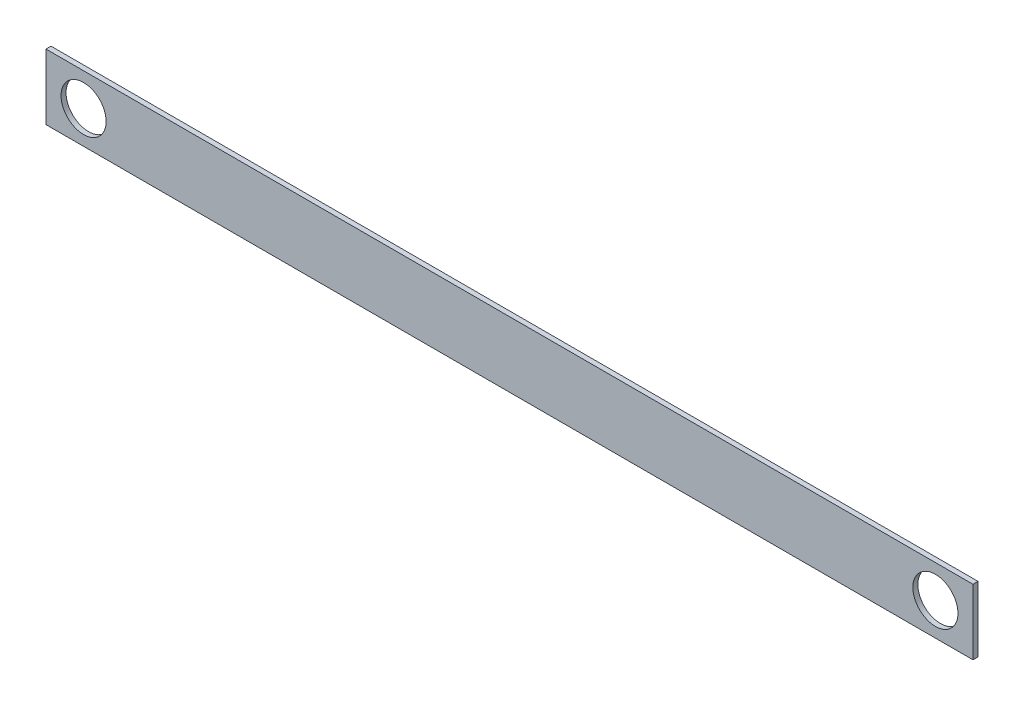
ISO-10303-21;
HEADER;
FILE_DESCRIPTION(('STEP AP214'),'2;1');
FILE_NAME('part.step','',(''),(''),'','','');
FILE_SCHEMA(('AUTOMOTIVE_DESIGN { 1 0 10303 214 1 1 1 1 }'));
ENDSEC;
DATA;
#1=APPLICATION_CONTEXT('core data for automotive mechanical design processes');
#2=APPLICATION_PROTOCOL_DEFINITION('international standard','automotive_design',2000,#1);
#3=PRODUCT_CONTEXT('',#1,'mechanical');
#4=PRODUCT('Part','Part','',(#3));
#5=PRODUCT_RELATED_PRODUCT_CATEGORY('part','',(#4));
#6=PRODUCT_DEFINITION_FORMATION('','',#4);
#7=PRODUCT_DEFINITION_CONTEXT('part definition',#1,'design');
#8=PRODUCT_DEFINITION('design','',#6,#7);
#9=PRODUCT_DEFINITION_SHAPE('','',#8);
#10=(LENGTH_UNIT() NAMED_UNIT(*) SI_UNIT(.MILLI.,.METRE.));
#11=(NAMED_UNIT(*) PLANE_ANGLE_UNIT() SI_UNIT($,.RADIAN.));
#12=(NAMED_UNIT(*) SI_UNIT($,.STERADIAN.) SOLID_ANGLE_UNIT());
#13=UNCERTAINTY_MEASURE_WITH_UNIT(LENGTH_MEASURE(1.E-05),#10,'distance_accuracy_value','');
#14=(GEOMETRIC_REPRESENTATION_CONTEXT(3) GLOBAL_UNCERTAINTY_ASSIGNED_CONTEXT((#13)) GLOBAL_UNIT_ASSIGNED_CONTEXT((#10,
#11,#12)) REPRESENTATION_CONTEXT('',''));
#15=CARTESIAN_POINT('',(0.,0.,0.));
#16=DIRECTION('',(0.,0.,1.));
#17=DIRECTION('',(1.,0.,0.));
#18=AXIS2_PLACEMENT_3D('',#15,#16,#17);
#19=CARTESIAN_POINT('',(-124.719101123596,20.1926163723917,2.));
#20=DIRECTION('',(1.,0.,0.));
#21=DIRECTION('',(0.,0.,-1.));
#22=AXIS2_PLACEMENT_3D('',#19,#20,#21);
#23=PLANE('',#22);
#24=DIRECTION('',(0.,-1.,0.));
#25=VECTOR('',#24,1.);
#26=CARTESIAN_POINT('',(-124.719101123596,20.1926163723917,0.));
#27=LINE('',#26,#25);
#28=CARTESIAN_POINT('',(-124.719101123596,20.1926163723917,0.));
#29=VERTEX_POINT('',#28);
#30=CARTESIAN_POINT('',(-124.719101123596,-5.9390048154093,0.));
#31=VERTEX_POINT('',#30);
#32=EDGE_CURVE('E96',#29,#31,#27,.T.);
#33=ORIENTED_EDGE('',*,*,#32,.T.);
#34=DIRECTION('',(0.,0.,-1.));
#35=VECTOR('',#34,1.);
#36=CARTESIAN_POINT('',(-124.719101123596,-5.9390048154093,2.));
#37=LINE('',#36,#35);
#38=CARTESIAN_POINT('',(-124.719101123596,-5.9390048154093,2.));
#39=VERTEX_POINT('',#38);
#40=EDGE_CURVE('E11',#39,#31,#37,.T.);
#41=ORIENTED_EDGE('',*,*,#40,.F.);
#42=DIRECTION('',(0.,-1.,0.));
#43=VECTOR('',#42,1.);
#44=CARTESIAN_POINT('',(-124.719101123596,20.1926163723917,2.));
#45=LINE('',#44,#43);
#46=CARTESIAN_POINT('',(-124.719101123596,20.1926163723917,2.));
#47=VERTEX_POINT('',#46);
#48=EDGE_CURVE('E84',#47,#39,#45,.T.);
#49=ORIENTED_EDGE('',*,*,#48,.F.);
#50=DIRECTION('',(0.,0.,-1.));
#51=VECTOR('',#50,1.);
#52=CARTESIAN_POINT('',(-124.719101123596,20.1926163723917,2.));
#53=LINE('',#52,#51);
#54=EDGE_CURVE('E92',#47,#29,#53,.T.);
#55=ORIENTED_EDGE('',*,*,#54,.T.);
#56=EDGE_LOOP('',(#33,#41,#49,#55));
#57=FACE_BOUND('',#56,.T.);
#58=ADVANCED_FACE('F33',(#57),#23,.F.);
#59=CARTESIAN_POINT('',(-124.719101123596,-5.9390048154093,2.));
#60=DIRECTION('',(0.,1.,0.));
#61=DIRECTION('',(0.,0.,1.));
#62=AXIS2_PLACEMENT_3D('',#59,#60,#61);
#63=PLANE('',#62);
#64=DIRECTION('',(1.,0.,0.));
#65=VECTOR('',#64,1.);
#66=CARTESIAN_POINT('',(-124.719101123596,-5.9390048154093,0.));
#67=LINE('',#66,#65);
#68=CARTESIAN_POINT('',(245.280898876405,-5.9390048154093,0.));
#69=VERTEX_POINT('',#68);
#70=EDGE_CURVE('E88',#31,#69,#67,.T.);
#71=ORIENTED_EDGE('',*,*,#70,.T.);
#72=DIRECTION('',(0.,0.,-1.));
#73=VECTOR('',#72,1.);
#74=CARTESIAN_POINT('',(245.280898876405,-5.9390048154093,2.));
#75=LINE('',#74,#73);
#76=CARTESIAN_POINT('',(245.280898876405,-5.9390048154093,2.));
#77=VERTEX_POINT('',#76);
#78=EDGE_CURVE('E41',#77,#69,#75,.T.);
#79=ORIENTED_EDGE('',*,*,#78,.F.);
#80=DIRECTION('',(1.,0.,0.));
#81=VECTOR('',#80,1.);
#82=CARTESIAN_POINT('',(-124.719101123596,-5.9390048154093,2.));
#83=LINE('',#82,#81);
#84=EDGE_CURVE('E79',#39,#77,#83,.T.);
#85=ORIENTED_EDGE('',*,*,#84,.F.);
#86=ORIENTED_EDGE('',*,*,#40,.T.);
#87=EDGE_LOOP('',(#71,#79,#85,#86));
#88=FACE_BOUND('',#87,.T.);
#89=ADVANCED_FACE('F87',(#88),#63,.F.);
#90=CARTESIAN_POINT('',(245.280898876405,20.1926163723917,2.));
#91=DIRECTION('',(-1.,0.,0.));
#92=DIRECTION('',(0.,0.,1.));
#93=AXIS2_PLACEMENT_3D('',#90,#91,#92);
#94=PLANE('',#93);
#95=DIRECTION('',(0.,1.,0.));
#96=VECTOR('',#95,1.);
#97=CARTESIAN_POINT('',(245.280898876405,20.1926163723917,0.));
#98=LINE('',#97,#96);
#99=CARTESIAN_POINT('',(245.280898876405,20.1926163723917,0.));
#100=VERTEX_POINT('',#99);
#101=EDGE_CURVE('E66',#69,#100,#98,.T.);
#102=ORIENTED_EDGE('',*,*,#101,.T.);
#103=DIRECTION('',(0.,0.,-1.));
#104=VECTOR('',#103,1.);
#105=CARTESIAN_POINT('',(245.280898876405,20.1926163723917,2.));
#106=LINE('',#105,#104);
#107=CARTESIAN_POINT('',(245.280898876405,20.1926163723917,2.));
#108=VERTEX_POINT('',#107);
#109=EDGE_CURVE('E89',#108,#100,#106,.T.);
#110=ORIENTED_EDGE('',*,*,#109,.F.);
#111=DIRECTION('',(0.,1.,0.));
#112=VECTOR('',#111,1.);
#113=CARTESIAN_POINT('',(245.280898876405,20.1926163723917,2.));
#114=LINE('',#113,#112);
#115=EDGE_CURVE('E82',#77,#108,#114,.T.);
#116=ORIENTED_EDGE('',*,*,#115,.F.);
#117=ORIENTED_EDGE('',*,*,#78,.T.);
#118=EDGE_LOOP('',(#102,#110,#116,#117));
#119=FACE_BOUND('',#118,.T.);
#120=ADVANCED_FACE('F90',(#119),#94,.F.);
#121=CARTESIAN_POINT('',(-124.719101123596,20.1926163723917,2.));
#122=DIRECTION('',(0.,-1.,0.));
#123=DIRECTION('',(0.,0.,-1.));
#124=AXIS2_PLACEMENT_3D('',#121,#122,#123);
#125=PLANE('',#124);
#126=DIRECTION('',(-1.,0.,0.));
#127=VECTOR('',#126,1.);
#128=CARTESIAN_POINT('',(-124.719101123596,20.1926163723917,0.));
#129=LINE('',#128,#127);
#130=EDGE_CURVE('E72',#100,#29,#129,.T.);
#131=ORIENTED_EDGE('',*,*,#130,.T.);
#132=ORIENTED_EDGE('',*,*,#54,.F.);
#133=DIRECTION('',(-1.,0.,0.));
#134=VECTOR('',#133,1.);
#135=CARTESIAN_POINT('',(-124.719101123596,20.1926163723917,2.));
#136=LINE('',#135,#134);
#137=EDGE_CURVE('E49',#108,#47,#136,.T.);
#138=ORIENTED_EDGE('',*,*,#137,.F.);
#139=ORIENTED_EDGE('',*,*,#109,.T.);
#140=EDGE_LOOP('',(#131,#132,#138,#139));
#141=FACE_BOUND('',#140,.T.);
#142=ADVANCED_FACE('F104',(#141),#125,.F.);
#143=CARTESIAN_POINT('',(0.,0.,2.));
#144=DIRECTION('',(0.,0.,1.));
#145=DIRECTION('',(1.,0.,0.));
#146=AXIS2_PLACEMENT_3D('',#143,#144,#145);
#147=PLANE('',#146);
#148=CARTESIAN_POINT('',(230.280898876405,7.12680577849113,2.));
#149=DIRECTION('',(0.,0.,1.));
#150=DIRECTION('',(1.,0.,0.));
#151=AXIS2_PLACEMENT_3D('',#148,#149,#150);
#152=CIRCLE('',#151,9.00000000000001);
#153=CARTESIAN_POINT('',(239.280898876405,7.12680577849113,2.));
#154=VERTEX_POINT('',#153);
#155=EDGE_CURVE('E116',#154,#154,#152,.T.);
#156=ORIENTED_EDGE('',*,*,#155,.F.);
#157=EDGE_LOOP('',(#156));
#158=FACE_BOUND('',#157,.T.);
#159=CARTESIAN_POINT('',(-109.719101123596,7.12680577849113,2.));
#160=DIRECTION('',(0.,0.,1.));
#161=DIRECTION('',(1.,0.,0.));
#162=AXIS2_PLACEMENT_3D('',#159,#160,#161);
#163=CIRCLE('',#162,9.);
#164=CARTESIAN_POINT('',(-100.719101123596,7.12680577849113,2.));
#165=VERTEX_POINT('',#164);
#166=EDGE_CURVE('E110',#165,#165,#163,.T.);
#167=ORIENTED_EDGE('',*,*,#166,.F.);
#168=EDGE_LOOP('',(#167));
#169=FACE_BOUND('',#168,.T.);
#170=ORIENTED_EDGE('',*,*,#48,.T.);
#171=ORIENTED_EDGE('',*,*,#84,.T.);
#172=ORIENTED_EDGE('',*,*,#115,.T.);
#173=ORIENTED_EDGE('',*,*,#137,.T.);
#174=EDGE_LOOP('',(#170,#171,#172,#173));
#175=FACE_BOUND('',#174,.T.);
#176=ADVANCED_FACE('F80',(#158,#169,#175),#147,.T.);
#177=CARTESIAN_POINT('',(0.,0.,0.));
#178=DIRECTION('',(0.,0.,1.));
#179=DIRECTION('',(1.,0.,0.));
#180=AXIS2_PLACEMENT_3D('',#177,#178,#179);
#181=PLANE('',#180);
#182=CARTESIAN_POINT('',(230.280898876405,7.12680577849113,0.));
#183=DIRECTION('',(0.,0.,1.));
#184=DIRECTION('',(1.,0.,0.));
#185=AXIS2_PLACEMENT_3D('',#182,#183,#184);
#186=CIRCLE('',#185,9.00000000000001);
#187=CARTESIAN_POINT('',(239.280898876405,7.12680577849113,0.));
#188=VERTEX_POINT('',#187);
#189=EDGE_CURVE('E113',#188,#188,#186,.T.);
#190=ORIENTED_EDGE('',*,*,#189,.T.);
#191=EDGE_LOOP('',(#190));
#192=FACE_BOUND('',#191,.T.);
#193=CARTESIAN_POINT('',(-109.719101123596,7.12680577849113,0.));
#194=DIRECTION('',(0.,0.,1.));
#195=DIRECTION('',(1.,0.,0.));
#196=AXIS2_PLACEMENT_3D('',#193,#194,#195);
#197=CIRCLE('',#196,9.);
#198=CARTESIAN_POINT('',(-100.719101123596,7.12680577849113,0.));
#199=VERTEX_POINT('',#198);
#200=EDGE_CURVE('E99',#199,#199,#197,.T.);
#201=ORIENTED_EDGE('',*,*,#200,.T.);
#202=EDGE_LOOP('',(#201));
#203=FACE_BOUND('',#202,.T.);
#204=ORIENTED_EDGE('',*,*,#32,.F.);
#205=ORIENTED_EDGE('',*,*,#130,.F.);
#206=ORIENTED_EDGE('',*,*,#101,.F.);
#207=ORIENTED_EDGE('',*,*,#70,.F.);
#208=EDGE_LOOP('',(#204,#205,#206,#207));
#209=FACE_BOUND('',#208,.T.);
#210=ADVANCED_FACE('F107',(#192,#203,#209),#181,.F.);
#211=CARTESIAN_POINT('',(-109.719101123596,7.12680577849113,0.));
#212=DIRECTION('',(0.,0.,1.));
#213=DIRECTION('',(1.,0.,0.));
#214=AXIS2_PLACEMENT_3D('',#211,#212,#213);
#215=CYLINDRICAL_SURFACE('',#214,9.);
#216=ORIENTED_EDGE('',*,*,#200,.F.);
#217=EDGE_LOOP('',(#216));
#218=FACE_BOUND('',#217,.T.);
#219=ORIENTED_EDGE('',*,*,#166,.T.);
#220=EDGE_LOOP('',(#219));
#221=FACE_BOUND('',#220,.T.);
#222=ADVANCED_FACE('F127',(#218,#221),#215,.F.);
#223=CARTESIAN_POINT('',(230.280898876405,7.12680577849113,0.));
#224=DIRECTION('',(0.,0.,1.));
#225=DIRECTION('',(1.,0.,0.));
#226=AXIS2_PLACEMENT_3D('',#223,#224,#225);
#227=CYLINDRICAL_SURFACE('',#226,9.00000000000001);
#228=ORIENTED_EDGE('',*,*,#189,.F.);
#229=EDGE_LOOP('',(#228));
#230=FACE_BOUND('',#229,.T.);
#231=ORIENTED_EDGE('',*,*,#155,.T.);
#232=EDGE_LOOP('',(#231));
#233=FACE_BOUND('',#232,.T.);
#234=ADVANCED_FACE('F124',(#230,#233),#227,.F.);
#235=CLOSED_SHELL('',(#58,#89,#120,#142,#176,#210,#222,#234));
#236=MANIFOLD_SOLID_BREP('B2',#235);
#237=ADVANCED_BREP_SHAPE_REPRESENTATION('',(#18,#236),#14);
#238=SHAPE_DEFINITION_REPRESENTATION(#9,#237);
ENDSEC;
END-ISO-10303-21;
